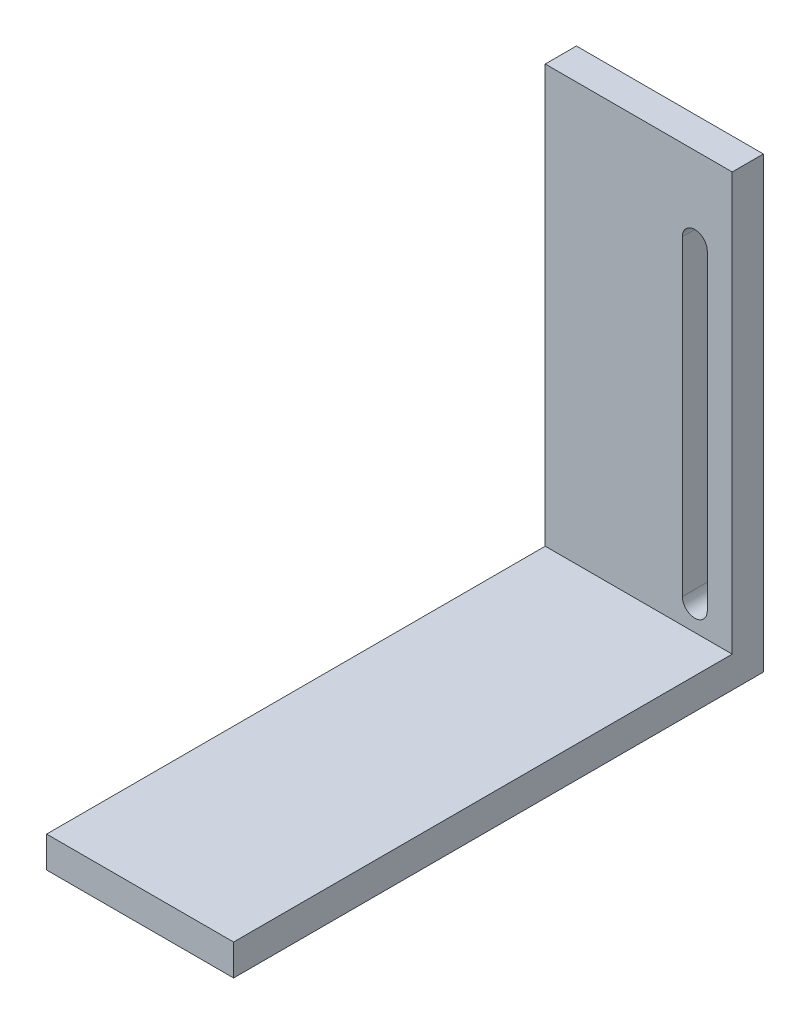
ISO-10303-21;
HEADER;
FILE_DESCRIPTION(('STEP AP214'),'2;1');
FILE_NAME('part.step','',(''),(''),'','','');
FILE_SCHEMA(('AUTOMOTIVE_DESIGN { 1 0 10303 214 1 1 1 1 }'));
ENDSEC;
DATA;
#1=APPLICATION_CONTEXT('core data for automotive mechanical design processes');
#2=APPLICATION_PROTOCOL_DEFINITION('international standard','automotive_design',2000,#1);
#3=PRODUCT_CONTEXT('',#1,'mechanical');
#4=PRODUCT('Part','Part','',(#3));
#5=PRODUCT_RELATED_PRODUCT_CATEGORY('part','',(#4));
#6=PRODUCT_DEFINITION_FORMATION('','',#4);
#7=PRODUCT_DEFINITION_CONTEXT('part definition',#1,'design');
#8=PRODUCT_DEFINITION('design','',#6,#7);
#9=PRODUCT_DEFINITION_SHAPE('','',#8);
#10=(LENGTH_UNIT() NAMED_UNIT(*) SI_UNIT(.MILLI.,.METRE.));
#11=(NAMED_UNIT(*) PLANE_ANGLE_UNIT() SI_UNIT($,.RADIAN.));
#12=(NAMED_UNIT(*) SI_UNIT($,.STERADIAN.) SOLID_ANGLE_UNIT());
#13=UNCERTAINTY_MEASURE_WITH_UNIT(LENGTH_MEASURE(1.E-05),#10,'distance_accuracy_value','');
#14=(GEOMETRIC_REPRESENTATION_CONTEXT(3) GLOBAL_UNCERTAINTY_ASSIGNED_CONTEXT((#13)) GLOBAL_UNIT_ASSIGNED_CONTEXT((#10,
#11,#12)) REPRESENTATION_CONTEXT('',''));
#15=CARTESIAN_POINT('',(0.,0.,0.));
#16=DIRECTION('',(0.,0.,1.));
#17=DIRECTION('',(1.,0.,0.));
#18=AXIS2_PLACEMENT_3D('',#15,#16,#17);
#19=CARTESIAN_POINT('',(0.,91.44,6.35));
#20=DIRECTION('',(0.,0.,-1.));
#21=DIRECTION('',(-1.,0.,0.));
#22=AXIS2_PLACEMENT_3D('',#19,#20,#21);
#23=PLANE('',#22);
#24=CARTESIAN_POINT('',(30.48,74.93,6.35));
#25=DIRECTION('',(0.,0.,1.));
#26=DIRECTION('',(1.,0.,0.));
#27=AXIS2_PLACEMENT_3D('',#24,#25,#26);
#28=CIRCLE('',#27,2.54);
#29=CARTESIAN_POINT('',(33.02,74.93,6.35));
#30=VERTEX_POINT('',#29);
#31=CARTESIAN_POINT('',(27.94,74.93,6.35));
#32=VERTEX_POINT('',#31);
#33=EDGE_CURVE('E142',#30,#32,#28,.T.);
#34=ORIENTED_EDGE('',*,*,#33,.F.);
#35=DIRECTION('',(0.,1.,0.));
#36=VECTOR('',#35,1.);
#37=CARTESIAN_POINT('',(33.02,74.93,6.35));
#38=LINE('',#37,#36);
#39=CARTESIAN_POINT('',(33.02,11.43,6.35));
#40=VERTEX_POINT('',#39);
#41=EDGE_CURVE('E165',#40,#30,#38,.T.);
#42=ORIENTED_EDGE('',*,*,#41,.F.);
#43=CARTESIAN_POINT('',(30.48,11.43,6.35));
#44=DIRECTION('',(0.,0.,1.));
#45=DIRECTION('',(1.,0.,0.));
#46=AXIS2_PLACEMENT_3D('',#43,#44,#45);
#47=CIRCLE('',#46,2.54);
#48=CARTESIAN_POINT('',(27.94,11.43,6.35));
#49=VERTEX_POINT('',#48);
#50=EDGE_CURVE('E332',#49,#40,#47,.T.);
#51=ORIENTED_EDGE('',*,*,#50,.F.);
#52=DIRECTION('',(0.,-1.,0.));
#53=VECTOR('',#52,1.);
#54=CARTESIAN_POINT('',(27.94,74.93,6.35));
#55=LINE('',#54,#53);
#56=EDGE_CURVE('E331',#32,#49,#55,.T.);
#57=ORIENTED_EDGE('',*,*,#56,.F.);
#58=EDGE_LOOP('',(#34,#42,#51,#57));
#59=FACE_BOUND('',#58,.T.);
#60=DIRECTION('',(-1.,0.,0.));
#61=VECTOR('',#60,1.);
#62=CARTESIAN_POINT('',(0.,6.35,6.35));
#63=LINE('',#62,#61);
#64=CARTESIAN_POINT('',(38.1,6.35,6.35));
#65=VERTEX_POINT('',#64);
#66=CARTESIAN_POINT('',(0.,6.35,6.35));
#67=VERTEX_POINT('',#66);
#68=EDGE_CURVE('E52',#65,#67,#63,.T.);
#69=ORIENTED_EDGE('',*,*,#68,.F.);
#70=DIRECTION('',(0.,1.,0.));
#71=VECTOR('',#70,1.);
#72=CARTESIAN_POINT('',(38.1,0.,6.35));
#73=LINE('',#72,#71);
#74=CARTESIAN_POINT('',(38.1,91.44,6.35));
#75=VERTEX_POINT('',#74);
#76=EDGE_CURVE('E146',#65,#75,#73,.T.);
#77=ORIENTED_EDGE('',*,*,#76,.T.);
#78=DIRECTION('',(-1.,0.,0.));
#79=VECTOR('',#78,1.);
#80=CARTESIAN_POINT('',(0.,91.44,6.35));
#81=LINE('',#80,#79);
#82=CARTESIAN_POINT('',(0.,91.44,6.35));
#83=VERTEX_POINT('',#82);
#84=EDGE_CURVE('E193',#75,#83,#81,.T.);
#85=ORIENTED_EDGE('',*,*,#84,.T.);
#86=DIRECTION('',(0.,-1.,0.));
#87=VECTOR('',#86,1.);
#88=CARTESIAN_POINT('',(0.,0.,6.35));
#89=LINE('',#88,#87);
#90=EDGE_CURVE('E184',#83,#67,#89,.T.);
#91=ORIENTED_EDGE('',*,*,#90,.T.);
#92=EDGE_LOOP('',(#69,#77,#85,#91));
#93=FACE_BOUND('',#92,.T.);
#94=ADVANCED_FACE('F35',(#59,#93),#23,.F.);
#95=CARTESIAN_POINT('',(0.,91.44,0.));
#96=DIRECTION('',(0.,0.,-1.));
#97=DIRECTION('',(-1.,0.,0.));
#98=AXIS2_PLACEMENT_3D('',#95,#96,#97);
#99=PLANE('',#98);
#100=DIRECTION('',(0.,-1.,0.));
#101=VECTOR('',#100,1.);
#102=CARTESIAN_POINT('',(0.,0.,0.));
#103=LINE('',#102,#101);
#104=CARTESIAN_POINT('',(0.,91.44,0.));
#105=VERTEX_POINT('',#104);
#106=CARTESIAN_POINT('',(0.,0.,0.));
#107=VERTEX_POINT('',#106);
#108=EDGE_CURVE('E120',#105,#107,#103,.T.);
#109=ORIENTED_EDGE('',*,*,#108,.F.);
#110=DIRECTION('',(-1.,0.,0.));
#111=VECTOR('',#110,1.);
#112=CARTESIAN_POINT('',(0.,91.44,0.));
#113=LINE('',#112,#111);
#114=CARTESIAN_POINT('',(38.1,91.44,0.));
#115=VERTEX_POINT('',#114);
#116=EDGE_CURVE('E185',#115,#105,#113,.T.);
#117=ORIENTED_EDGE('',*,*,#116,.F.);
#118=DIRECTION('',(0.,1.,0.));
#119=VECTOR('',#118,1.);
#120=CARTESIAN_POINT('',(38.1,0.,0.));
#121=LINE('',#120,#119);
#122=CARTESIAN_POINT('',(38.1,0.,0.));
#123=VERTEX_POINT('',#122);
#124=EDGE_CURVE('E195',#123,#115,#121,.T.);
#125=ORIENTED_EDGE('',*,*,#124,.F.);
#126=DIRECTION('',(1.,0.,0.));
#127=VECTOR('',#126,1.);
#128=CARTESIAN_POINT('',(0.,0.,0.));
#129=LINE('',#128,#127);
#130=EDGE_CURVE('E197',#107,#123,#129,.T.);
#131=ORIENTED_EDGE('',*,*,#130,.F.);
#132=EDGE_LOOP('',(#109,#117,#125,#131));
#133=FACE_BOUND('',#132,.T.);
#134=DIRECTION('',(0.,1.,0.));
#135=VECTOR('',#134,1.);
#136=CARTESIAN_POINT('',(33.02,74.93,0.));
#137=LINE('',#136,#135);
#138=CARTESIAN_POINT('',(33.02,11.43,0.));
#139=VERTEX_POINT('',#138);
#140=CARTESIAN_POINT('',(33.02,74.93,0.));
#141=VERTEX_POINT('',#140);
#142=EDGE_CURVE('E170',#139,#141,#137,.T.);
#143=ORIENTED_EDGE('',*,*,#142,.T.);
#144=CARTESIAN_POINT('',(30.48,74.93,0.));
#145=DIRECTION('',(0.,0.,1.));
#146=DIRECTION('',(1.,0.,0.));
#147=AXIS2_PLACEMENT_3D('',#144,#145,#146);
#148=CIRCLE('',#147,2.54);
#149=CARTESIAN_POINT('',(27.94,74.93,0.));
#150=VERTEX_POINT('',#149);
#151=EDGE_CURVE('E153',#141,#150,#148,.T.);
#152=ORIENTED_EDGE('',*,*,#151,.T.);
#153=DIRECTION('',(0.,-1.,0.));
#154=VECTOR('',#153,1.);
#155=CARTESIAN_POINT('',(27.94,74.93,0.));
#156=LINE('',#155,#154);
#157=CARTESIAN_POINT('',(27.94,11.43,0.));
#158=VERTEX_POINT('',#157);
#159=EDGE_CURVE('E157',#150,#158,#156,.T.);
#160=ORIENTED_EDGE('',*,*,#159,.T.);
#161=CARTESIAN_POINT('',(30.48,11.43,0.));
#162=DIRECTION('',(0.,0.,1.));
#163=DIRECTION('',(1.,0.,0.));
#164=AXIS2_PLACEMENT_3D('',#161,#162,#163);
#165=CIRCLE('',#164,2.54);
#166=EDGE_CURVE('E162',#158,#139,#165,.T.);
#167=ORIENTED_EDGE('',*,*,#166,.T.);
#168=EDGE_LOOP('',(#143,#152,#160,#167));
#169=FACE_BOUND('',#168,.T.);
#170=ADVANCED_FACE('F221',(#133,#169),#99,.T.);
#171=CARTESIAN_POINT('',(0.,0.,6.35));
#172=DIRECTION('',(1.,0.,0.));
#173=DIRECTION('',(0.,0.,-1.));
#174=AXIS2_PLACEMENT_3D('',#171,#172,#173);
#175=PLANE('',#174);
#176=ORIENTED_EDGE('',*,*,#108,.T.);
#177=DIRECTION('',(0.,0.,-1.));
#178=VECTOR('',#177,1.);
#179=CARTESIAN_POINT('',(0.,0.,6.35));
#180=LINE('',#179,#178);
#181=CARTESIAN_POINT('',(0.,0.,107.95));
#182=VERTEX_POINT('',#181);
#183=EDGE_CURVE('E11',#182,#107,#180,.T.);
#184=ORIENTED_EDGE('',*,*,#183,.F.);
#185=DIRECTION('',(0.,-1.,0.));
#186=VECTOR('',#185,1.);
#187=CARTESIAN_POINT('',(0.,0.,107.95));
#188=LINE('',#187,#186);
#189=CARTESIAN_POINT('',(0.,6.35,107.95));
#190=VERTEX_POINT('',#189);
#191=EDGE_CURVE('E117',#190,#182,#188,.T.);
#192=ORIENTED_EDGE('',*,*,#191,.F.);
#193=DIRECTION('',(0.,0.,-1.));
#194=VECTOR('',#193,1.);
#195=CARTESIAN_POINT('',(0.,6.35,107.95));
#196=LINE('',#195,#194);
#197=EDGE_CURVE('E139',#190,#67,#196,.T.);
#198=ORIENTED_EDGE('',*,*,#197,.T.);
#199=ORIENTED_EDGE('',*,*,#90,.F.);
#200=DIRECTION('',(0.,0.,-1.));
#201=VECTOR('',#200,1.);
#202=CARTESIAN_POINT('',(0.,91.44,6.35));
#203=LINE('',#202,#201);
#204=EDGE_CURVE('E191',#83,#105,#203,.T.);
#205=ORIENTED_EDGE('',*,*,#204,.T.);
#206=EDGE_LOOP('',(#176,#184,#192,#198,#199,#205));
#207=FACE_BOUND('',#206,.T.);
#208=ADVANCED_FACE('F37',(#207),#175,.F.);
#209=CARTESIAN_POINT('',(0.,0.,6.35));
#210=DIRECTION('',(0.,1.,0.));
#211=DIRECTION('',(0.,0.,1.));
#212=AXIS2_PLACEMENT_3D('',#209,#210,#211);
#213=PLANE('',#212);
#214=ORIENTED_EDGE('',*,*,#130,.T.);
#215=DIRECTION('',(0.,0.,-1.));
#216=VECTOR('',#215,1.);
#217=CARTESIAN_POINT('',(38.1,0.,6.35));
#218=LINE('',#217,#216);
#219=CARTESIAN_POINT('',(38.1,0.,107.95));
#220=VERTEX_POINT('',#219);
#221=EDGE_CURVE('E44',#220,#123,#218,.T.);
#222=ORIENTED_EDGE('',*,*,#221,.F.);
#223=DIRECTION('',(1.,0.,0.));
#224=VECTOR('',#223,1.);
#225=CARTESIAN_POINT('',(0.,0.,107.95));
#226=LINE('',#225,#224);
#227=EDGE_CURVE('E123',#182,#220,#226,.T.);
#228=ORIENTED_EDGE('',*,*,#227,.F.);
#229=ORIENTED_EDGE('',*,*,#183,.T.);
#230=EDGE_LOOP('',(#214,#222,#228,#229));
#231=FACE_BOUND('',#230,.T.);
#232=ADVANCED_FACE('F124',(#231),#213,.F.);
#233=CARTESIAN_POINT('',(38.1,0.,6.35));
#234=DIRECTION('',(-1.,0.,0.));
#235=DIRECTION('',(0.,0.,1.));
#236=AXIS2_PLACEMENT_3D('',#233,#234,#235);
#237=PLANE('',#236);
#238=ORIENTED_EDGE('',*,*,#124,.T.);
#239=DIRECTION('',(0.,0.,-1.));
#240=VECTOR('',#239,1.);
#241=CARTESIAN_POINT('',(38.1,91.44,6.35));
#242=LINE('',#241,#240);
#243=EDGE_CURVE('E188',#75,#115,#242,.T.);
#244=ORIENTED_EDGE('',*,*,#243,.F.);
#245=ORIENTED_EDGE('',*,*,#76,.F.);
#246=DIRECTION('',(0.,0.,-1.));
#247=VECTOR('',#246,1.);
#248=CARTESIAN_POINT('',(38.1,6.35,107.95));
#249=LINE('',#248,#247);
#250=CARTESIAN_POINT('',(38.1,6.35,107.95));
#251=VERTEX_POINT('',#250);
#252=EDGE_CURVE('E150',#251,#65,#249,.T.);
#253=ORIENTED_EDGE('',*,*,#252,.F.);
#254=DIRECTION('',(0.,1.,0.));
#255=VECTOR('',#254,1.);
#256=CARTESIAN_POINT('',(38.1,0.,107.95));
#257=LINE('',#256,#255);
#258=EDGE_CURVE('E128',#220,#251,#257,.T.);
#259=ORIENTED_EDGE('',*,*,#258,.F.);
#260=ORIENTED_EDGE('',*,*,#221,.T.);
#261=EDGE_LOOP('',(#238,#244,#245,#253,#259,#260));
#262=FACE_BOUND('',#261,.T.);
#263=ADVANCED_FACE('F203',(#262),#237,.F.);
#264=CARTESIAN_POINT('',(0.,91.44,6.35));
#265=DIRECTION('',(0.,-1.,0.));
#266=DIRECTION('',(0.,0.,-1.));
#267=AXIS2_PLACEMENT_3D('',#264,#265,#266);
#268=PLANE('',#267);
#269=ORIENTED_EDGE('',*,*,#116,.T.);
#270=ORIENTED_EDGE('',*,*,#204,.F.);
#271=ORIENTED_EDGE('',*,*,#84,.F.);
#272=ORIENTED_EDGE('',*,*,#243,.T.);
#273=EDGE_LOOP('',(#269,#270,#271,#272));
#274=FACE_BOUND('',#273,.T.);
#275=ADVANCED_FACE('F207',(#274),#268,.F.);
#276=CARTESIAN_POINT('',(30.48,74.93,6.35));
#277=DIRECTION('',(0.,0.,-1.));
#278=DIRECTION('',(-1.,0.,0.));
#279=AXIS2_PLACEMENT_3D('',#276,#277,#278);
#280=CYLINDRICAL_SURFACE('',#279,2.54);
#281=ORIENTED_EDGE('',*,*,#151,.F.);
#282=DIRECTION('',(0.,0.,-1.));
#283=VECTOR('',#282,1.);
#284=CARTESIAN_POINT('',(33.02,74.93,6.35));
#285=LINE('',#284,#283);
#286=EDGE_CURVE('E172',#30,#141,#285,.T.);
#287=ORIENTED_EDGE('',*,*,#286,.F.);
#288=ORIENTED_EDGE('',*,*,#33,.T.);
#289=DIRECTION('',(0.,0.,-1.));
#290=VECTOR('',#289,1.);
#291=CARTESIAN_POINT('',(27.94,74.93,6.35));
#292=LINE('',#291,#290);
#293=EDGE_CURVE('E178',#32,#150,#292,.T.);
#294=ORIENTED_EDGE('',*,*,#293,.T.);
#295=EDGE_LOOP('',(#281,#287,#288,#294));
#296=FACE_BOUND('',#295,.T.);
#297=ADVANCED_FACE('F231',(#296),#280,.F.);
#298=CARTESIAN_POINT('',(27.94,74.93,6.35));
#299=DIRECTION('',(1.,0.,0.));
#300=DIRECTION('',(0.,0.,-1.));
#301=AXIS2_PLACEMENT_3D('',#298,#299,#300);
#302=PLANE('',#301);
#303=ORIENTED_EDGE('',*,*,#159,.F.);
#304=ORIENTED_EDGE('',*,*,#293,.F.);
#305=ORIENTED_EDGE('',*,*,#56,.T.);
#306=DIRECTION('',(0.,0.,-1.));
#307=VECTOR('',#306,1.);
#308=CARTESIAN_POINT('',(27.94,11.43,6.35));
#309=LINE('',#308,#307);
#310=EDGE_CURVE('E176',#49,#158,#309,.T.);
#311=ORIENTED_EDGE('',*,*,#310,.T.);
#312=EDGE_LOOP('',(#303,#304,#305,#311));
#313=FACE_BOUND('',#312,.T.);
#314=ADVANCED_FACE('F264',(#313),#302,.T.);
#315=CARTESIAN_POINT('',(30.48,11.43,6.35));
#316=DIRECTION('',(0.,0.,-1.));
#317=DIRECTION('',(-1.,0.,0.));
#318=AXIS2_PLACEMENT_3D('',#315,#316,#317);
#319=CYLINDRICAL_SURFACE('',#318,2.54);
#320=ORIENTED_EDGE('',*,*,#166,.F.);
#321=ORIENTED_EDGE('',*,*,#310,.F.);
#322=ORIENTED_EDGE('',*,*,#50,.T.);
#323=DIRECTION('',(0.,0.,-1.));
#324=VECTOR('',#323,1.);
#325=CARTESIAN_POINT('',(33.02,11.43,6.35));
#326=LINE('',#325,#324);
#327=EDGE_CURVE('E60',#40,#139,#326,.T.);
#328=ORIENTED_EDGE('',*,*,#327,.T.);
#329=EDGE_LOOP('',(#320,#321,#322,#328));
#330=FACE_BOUND('',#329,.T.);
#331=ADVANCED_FACE('F218',(#330),#319,.F.);
#332=CARTESIAN_POINT('',(33.02,74.93,6.35));
#333=DIRECTION('',(-1.,0.,0.));
#334=DIRECTION('',(0.,-1.,0.));
#335=AXIS2_PLACEMENT_3D('',#332,#333,#334);
#336=PLANE('',#335);
#337=ORIENTED_EDGE('',*,*,#142,.F.);
#338=ORIENTED_EDGE('',*,*,#327,.F.);
#339=ORIENTED_EDGE('',*,*,#41,.T.);
#340=ORIENTED_EDGE('',*,*,#286,.T.);
#341=EDGE_LOOP('',(#337,#338,#339,#340));
#342=FACE_BOUND('',#341,.T.);
#343=ADVANCED_FACE('F211',(#342),#336,.T.);
#344=CARTESIAN_POINT('',(0.,6.35,107.95));
#345=DIRECTION('',(0.,-1.,0.));
#346=DIRECTION('',(0.,0.,-1.));
#347=AXIS2_PLACEMENT_3D('',#344,#345,#346);
#348=PLANE('',#347);
#349=ORIENTED_EDGE('',*,*,#68,.T.);
#350=ORIENTED_EDGE('',*,*,#197,.F.);
#351=DIRECTION('',(-1.,0.,0.));
#352=VECTOR('',#351,1.);
#353=CARTESIAN_POINT('',(0.,6.35,107.95));
#354=LINE('',#353,#352);
#355=EDGE_CURVE('E132',#251,#190,#354,.T.);
#356=ORIENTED_EDGE('',*,*,#355,.F.);
#357=ORIENTED_EDGE('',*,*,#252,.T.);
#358=EDGE_LOOP('',(#349,#350,#356,#357));
#359=FACE_BOUND('',#358,.T.);
#360=ADVANCED_FACE('F209',(#359),#348,.F.);
#361=CARTESIAN_POINT('',(0.,6.35,107.95));
#362=DIRECTION('',(0.,0.,-1.));
#363=DIRECTION('',(-1.,0.,0.));
#364=AXIS2_PLACEMENT_3D('',#361,#362,#363);
#365=PLANE('',#364);
#366=ORIENTED_EDGE('',*,*,#191,.T.);
#367=ORIENTED_EDGE('',*,*,#227,.T.);
#368=ORIENTED_EDGE('',*,*,#258,.T.);
#369=ORIENTED_EDGE('',*,*,#355,.T.);
#370=EDGE_LOOP('',(#366,#367,#368,#369));
#371=FACE_BOUND('',#370,.T.);
#372=ADVANCED_FACE('F130',(#371),#365,.F.);
#373=CLOSED_SHELL('',(#94,#170,#208,#232,#263,#275,#297,#314,#331,#343,#360,#372));
#374=MANIFOLD_SOLID_BREP('B2',#373);
#375=ADVANCED_BREP_SHAPE_REPRESENTATION('',(#18,#374),#14);
#376=SHAPE_DEFINITION_REPRESENTATION(#9,#375);
ENDSEC;
END-ISO-10303-21;
